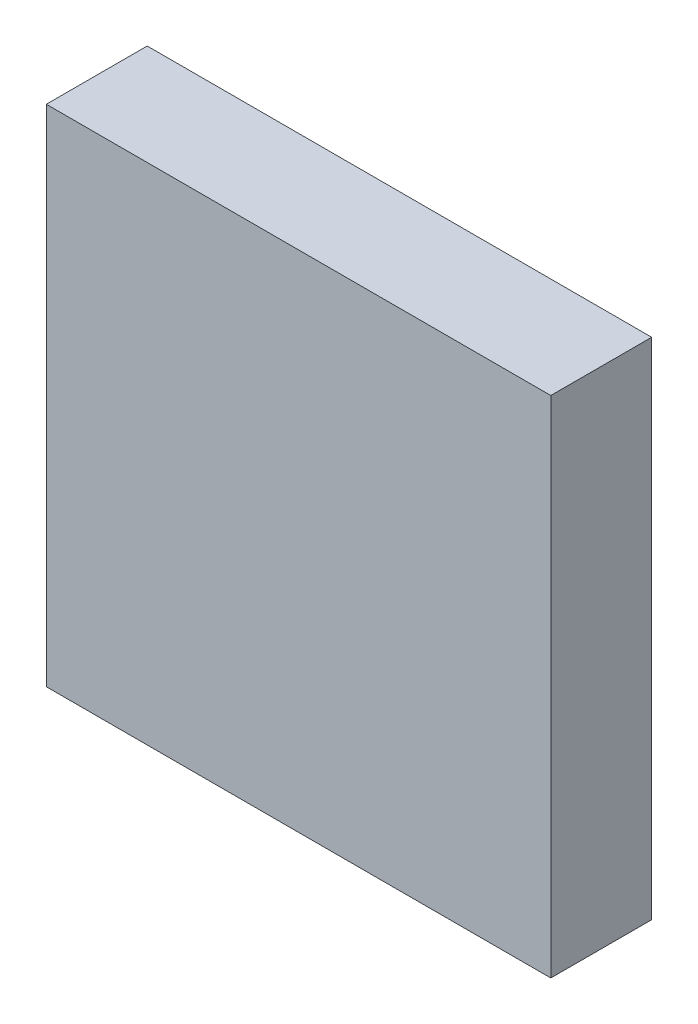
ISO-10303-21;
HEADER;
FILE_DESCRIPTION(('STEP AP214'),'2;1');
FILE_NAME('part.step','',(''),(''),'','','');
FILE_SCHEMA(('AUTOMOTIVE_DESIGN { 1 0 10303 214 1 1 1 1 }'));
ENDSEC;
DATA;
#1=APPLICATION_CONTEXT('core data for automotive mechanical design processes');
#2=APPLICATION_PROTOCOL_DEFINITION('international standard','automotive_design',2000,#1);
#3=PRODUCT_CONTEXT('',#1,'mechanical');
#4=PRODUCT('Part','Part','',(#3));
#5=PRODUCT_RELATED_PRODUCT_CATEGORY('part','',(#4));
#6=PRODUCT_DEFINITION_FORMATION('','',#4);
#7=PRODUCT_DEFINITION_CONTEXT('part definition',#1,'design');
#8=PRODUCT_DEFINITION('design','',#6,#7);
#9=PRODUCT_DEFINITION_SHAPE('','',#8);
#10=(LENGTH_UNIT() NAMED_UNIT(*) SI_UNIT(.MILLI.,.METRE.));
#11=(NAMED_UNIT(*) PLANE_ANGLE_UNIT() SI_UNIT($,.RADIAN.));
#12=(NAMED_UNIT(*) SI_UNIT($,.STERADIAN.) SOLID_ANGLE_UNIT());
#13=UNCERTAINTY_MEASURE_WITH_UNIT(LENGTH_MEASURE(1.E-05),#10,'distance_accuracy_value','');
#14=(GEOMETRIC_REPRESENTATION_CONTEXT(3) GLOBAL_UNCERTAINTY_ASSIGNED_CONTEXT((#13)) GLOBAL_UNIT_ASSIGNED_CONTEXT((#10,
#11,#12)) REPRESENTATION_CONTEXT('',''));
#15=CARTESIAN_POINT('',(0.,0.,0.));
#16=DIRECTION('',(0.,0.,1.));
#17=DIRECTION('',(1.,0.,0.));
#18=AXIS2_PLACEMENT_3D('',#15,#16,#17);
#19=CARTESIAN_POINT('',(-26.3757765244034,-0.619272768192042,-0.699998846695338));
#20=DIRECTION('',(0.,8.74227339409094E-08,-1.));
#21=DIRECTION('',(-4.37113882867396E-08,-1.,-8.74227339409093E-08));
#22=AXIS2_PLACEMENT_3D('',#19,#20,#21);
#23=PLANE('',#22);
#24=CARTESIAN_POINT('',(-26.3757765244034,-0.619272768192042,-0.699998846695338));
#25=DIRECTION('',(0.,8.74227339409094E-08,-1.));
#26=DIRECTION('',(-4.37113882867396E-08,-1.,-8.74227339409093E-08));
#27=AXIS2_PLACEMENT_3D('',#24,#25,#26);
#28=CIRCLE('',#27,0.25);
#29=CARTESIAN_POINT('',(-26.3757765353312,-0.869272768192042,-0.699998868551022));
#30=VERTEX_POINT('',#29);
#31=EDGE_CURVE('E11',#30,#30,#28,.T.);
#32=ORIENTED_EDGE('',*,*,#31,.T.);
#33=EDGE_LOOP('',(#32));
#34=FACE_BOUND('',#33,.T.);
#35=ADVANCED_FACE('F17',(#34),#23,.T.);
#36=CARTESIAN_POINT('',(-26.3757765244034,-0.619272768192042,-0.699998846695338));
#37=DIRECTION('',(0.,8.74227339409094E-08,-1.));
#38=DIRECTION('',(-4.37113882867396E-08,-1.,-8.74227339409093E-08));
#39=AXIS2_PLACEMENT_3D('',#36,#37,#38);
#40=CYLINDRICAL_SURFACE('',#39,0.25);
#41=CARTESIAN_POINT('',(-26.3757765244034,-0.619272759449771,-0.799998846695337));
#42=DIRECTION('',(0.,8.74227339409094E-08,-1.));
#43=DIRECTION('',(-4.37113882867396E-08,-1.,-8.74227339409093E-08));
#44=AXIS2_PLACEMENT_3D('',#41,#42,#43);
#45=CIRCLE('',#44,0.25);
#46=CARTESIAN_POINT('',(-26.3757765353312,-0.869272759449771,-0.799998868551021));
#47=VERTEX_POINT('',#46);
#48=EDGE_CURVE('E111',#47,#47,#45,.T.);
#49=ORIENTED_EDGE('',*,*,#48,.T.);
#50=EDGE_LOOP('',(#49));
#51=FACE_BOUND('',#50,.T.);
#52=ORIENTED_EDGE('',*,*,#31,.F.);
#53=EDGE_LOOP('',(#52));
#54=FACE_BOUND('',#53,.T.);
#55=ADVANCED_FACE('F169',(#51,#54),#40,.F.);
#56=CARTESIAN_POINT('',(-23.042443336775,-3.95260630842558,8.6189553410998E-07));
#57=DIRECTION('',(-4.37113882867396E-08,-1.,-8.74227339409093E-08));
#58=DIRECTION('',(0.,8.74227339409094E-08,-1.));
#59=AXIS2_PLACEMENT_3D('',#56,#57,#58);
#60=PLANE('',#59);
#61=DIRECTION('',(0.,8.74227339409094E-08,-1.));
#62=VECTOR('',#61,1.);
#63=CARTESIAN_POINT('',(-23.042443336775,-3.95260630842558,8.6189553410998E-07));
#64=LINE('',#63,#62);
#65=CARTESIAN_POINT('',(-23.042443336775,-3.95260630842558,8.6189553410998E-07));
#66=VERTEX_POINT('',#65);
#67=CARTESIAN_POINT('',(-23.042443336775,-3.95260623848738,-0.799999138104463));
#68=VERTEX_POINT('',#67);
#69=EDGE_CURVE('E76',#66,#68,#64,.T.);
#70=ORIENTED_EDGE('',*,*,#69,.F.);
#71=DIRECTION('',(-1.,4.37113882867395E-08,0.));
#72=VECTOR('',#71,1.);
#73=CARTESIAN_POINT('',(-23.042443336775,-3.95260630842558,8.6189553410998E-07));
#74=LINE('',#73,#72);
#75=CARTESIAN_POINT('',(-27.042443336775,-3.95260613358002,8.61895549722491E-07));
#76=VERTEX_POINT('',#75);
#77=EDGE_CURVE('E26',#66,#76,#74,.T.);
#78=ORIENTED_EDGE('',*,*,#77,.T.);
#79=DIRECTION('',(0.,8.74227339409094E-08,-1.));
#80=VECTOR('',#79,1.);
#81=CARTESIAN_POINT('',(-27.042443336775,-3.95260613358002,8.61895549722491E-07));
#82=LINE('',#81,#80);
#83=CARTESIAN_POINT('',(-27.042443336775,-3.95260606364184,-0.799999138104448));
#84=VERTEX_POINT('',#83);
#85=EDGE_CURVE('E71',#76,#84,#82,.T.);
#86=ORIENTED_EDGE('',*,*,#85,.T.);
#87=DIRECTION('',(-1.,4.37113882867395E-08,0.));
#88=VECTOR('',#87,1.);
#89=CARTESIAN_POINT('',(-23.042443336775,-3.95260623848738,-0.799999138104463));
#90=LINE('',#89,#88);
#91=EDGE_CURVE('E81',#68,#84,#90,.T.);
#92=ORIENTED_EDGE('',*,*,#91,.F.);
#93=EDGE_LOOP('',(#70,#78,#86,#92));
#94=FACE_BOUND('',#93,.T.);
#95=ADVANCED_FACE('F84',(#94),#60,.T.);
#96=CARTESIAN_POINT('',(-23.0424431619295,0.0473936915744155,1.21158647004016E-06));
#97=DIRECTION('',(0.,8.74227339409094E-08,-1.));
#98=DIRECTION('',(-4.37113882867396E-08,-1.,-8.74227339409093E-08));
#99=AXIS2_PLACEMENT_3D('',#96,#97,#98);
#100=PLANE('',#99);
#101=DIRECTION('',(-4.37113882867396E-08,-1.,-8.74227339409093E-08));
#102=VECTOR('',#101,1.);
#103=CARTESIAN_POINT('',(-27.0424431619295,0.0473938664199702,1.21158648521899E-06));
#104=LINE('',#103,#102);
#105=CARTESIAN_POINT('',(-27.0424431619295,0.0473938664199702,1.21158648521899E-06));
#106=VERTEX_POINT('',#105);
#107=EDGE_CURVE('E69',#106,#76,#104,.T.);
#108=ORIENTED_EDGE('',*,*,#107,.T.);
#109=ORIENTED_EDGE('',*,*,#77,.F.);
#110=DIRECTION('',(-4.37113882867396E-08,-1.,-8.74227339409093E-08));
#111=VECTOR('',#110,1.);
#112=CARTESIAN_POINT('',(-23.0424431619295,0.0473936915744155,1.21158647004016E-06));
#113=LINE('',#112,#111);
#114=CARTESIAN_POINT('',(-23.0424431619295,0.0473936915744155,1.21158647004016E-06));
#115=VERTEX_POINT('',#114);
#116=EDGE_CURVE('E64',#115,#66,#113,.T.);
#117=ORIENTED_EDGE('',*,*,#116,.F.);
#118=DIRECTION('',(-1.,4.37113882867395E-08,0.));
#119=VECTOR('',#118,1.);
#120=CARTESIAN_POINT('',(-23.0424431619295,0.0473936915744155,1.21158647004016E-06));
#121=LINE('',#120,#119);
#122=EDGE_CURVE('E93',#115,#106,#121,.T.);
#123=ORIENTED_EDGE('',*,*,#122,.T.);
#124=EDGE_LOOP('',(#108,#109,#117,#123));
#125=FACE_BOUND('',#124,.T.);
#126=ADVANCED_FACE('F68',(#125),#100,.F.);
#127=CARTESIAN_POINT('',(-27.0424431619295,0.0473938664199702,1.21158648521899E-06));
#128=DIRECTION('',(-1.,4.37113882867395E-08,0.));
#129=DIRECTION('',(0.,8.74227339409094E-08,-1.));
#130=AXIS2_PLACEMENT_3D('',#127,#128,#129);
#131=PLANE('',#130);
#132=ORIENTED_EDGE('',*,*,#107,.F.);
#133=DIRECTION('',(0.,8.74227339409094E-08,-1.));
#134=VECTOR('',#133,1.);
#135=CARTESIAN_POINT('',(-27.0424431619295,0.0473938664199702,1.21158648521899E-06));
#136=LINE('',#135,#134);
#137=CARTESIAN_POINT('',(-27.0424431619295,0.0473939363581644,-0.799998788413512));
#138=VERTEX_POINT('',#137);
#139=EDGE_CURVE('E135',#106,#138,#136,.T.);
#140=ORIENTED_EDGE('',*,*,#139,.T.);
#141=DIRECTION('',(-4.37113882867396E-08,-1.,-8.74227339409093E-08));
#142=VECTOR('',#141,1.);
#143=CARTESIAN_POINT('',(-27.0424431619295,0.0473939363581644,-0.799998788413512));
#144=LINE('',#143,#142);
#145=EDGE_CURVE('E109',#138,#84,#144,.T.);
#146=ORIENTED_EDGE('',*,*,#145,.T.);
#147=ORIENTED_EDGE('',*,*,#85,.F.);
#148=EDGE_LOOP('',(#132,#140,#146,#147));
#149=FACE_BOUND('',#148,.T.);
#150=ADVANCED_FACE('F158',(#149),#131,.T.);
#151=CARTESIAN_POINT('',(-23.0424431619295,0.0473937615126097,-0.799998788413527));
#152=DIRECTION('',(0.,8.74227339409094E-08,-1.));
#153=DIRECTION('',(-4.37113882867396E-08,-1.,-8.74227339409093E-08));
#154=AXIS2_PLACEMENT_3D('',#151,#152,#153);
#155=PLANE('',#154);
#156=ORIENTED_EDGE('',*,*,#48,.F.);
#157=EDGE_LOOP('',(#156));
#158=FACE_BOUND('',#157,.T.);
#159=DIRECTION('',(-1.,4.37113882867395E-08,0.));
#160=VECTOR('',#159,1.);
#161=CARTESIAN_POINT('',(-23.0424431619295,0.0473937615126097,-0.799998788413527));
#162=LINE('',#161,#160);
#163=CARTESIAN_POINT('',(-23.0424431619295,0.0473937615126097,-0.799998788413527));
#164=VERTEX_POINT('',#163);
#165=EDGE_CURVE('E139',#164,#138,#162,.T.);
#166=ORIENTED_EDGE('',*,*,#165,.F.);
#167=DIRECTION('',(-4.37113882867396E-08,-1.,-8.74227339409093E-08));
#168=VECTOR('',#167,1.);
#169=CARTESIAN_POINT('',(-23.0424431619295,0.0473937615126097,-0.799998788413527));
#170=LINE('',#169,#168);
#171=EDGE_CURVE('E82',#164,#68,#170,.T.);
#172=ORIENTED_EDGE('',*,*,#171,.T.);
#173=ORIENTED_EDGE('',*,*,#91,.T.);
#174=ORIENTED_EDGE('',*,*,#145,.F.);
#175=EDGE_LOOP('',(#166,#172,#173,#174));
#176=FACE_BOUND('',#175,.T.);
#177=ADVANCED_FACE('F156',(#158,#176),#155,.T.);
#178=CARTESIAN_POINT('',(-23.0424431619295,0.0473936915744155,1.21158647004016E-06));
#179=DIRECTION('',(-1.,4.37113882867395E-08,0.));
#180=DIRECTION('',(0.,8.74227339409094E-08,-1.));
#181=AXIS2_PLACEMENT_3D('',#178,#179,#180);
#182=PLANE('',#181);
#183=ORIENTED_EDGE('',*,*,#69,.T.);
#184=ORIENTED_EDGE('',*,*,#171,.F.);
#185=DIRECTION('',(0.,8.74227339409094E-08,-1.));
#186=VECTOR('',#185,1.);
#187=CARTESIAN_POINT('',(-23.0424431619295,0.0473936915744155,1.21158647004016E-06));
#188=LINE('',#187,#186);
#189=EDGE_CURVE('E78',#115,#164,#188,.T.);
#190=ORIENTED_EDGE('',*,*,#189,.F.);
#191=ORIENTED_EDGE('',*,*,#116,.T.);
#192=EDGE_LOOP('',(#183,#184,#190,#191));
#193=FACE_BOUND('',#192,.T.);
#194=ADVANCED_FACE('F75',(#193),#182,.F.);
#195=CARTESIAN_POINT('',(-23.0424431619295,0.0473936915744155,1.21158647004016E-06));
#196=DIRECTION('',(-4.37113882867396E-08,-1.,-8.74227339409093E-08));
#197=DIRECTION('',(0.,8.74227339409094E-08,-1.));
#198=AXIS2_PLACEMENT_3D('',#195,#196,#197);
#199=PLANE('',#198);
#200=ORIENTED_EDGE('',*,*,#165,.T.);
#201=ORIENTED_EDGE('',*,*,#139,.F.);
#202=ORIENTED_EDGE('',*,*,#122,.F.);
#203=ORIENTED_EDGE('',*,*,#189,.T.);
#204=EDGE_LOOP('',(#200,#201,#202,#203));
#205=FACE_BOUND('',#204,.T.);
#206=ADVANCED_FACE('F154',(#205),#199,.F.);
#207=CLOSED_SHELL('',(#35,#55,#95,#126,#150,#177,#194,#206));
#208=MANIFOLD_SOLID_BREP('B1',#207);
#209=ADVANCED_BREP_SHAPE_REPRESENTATION('',(#18,#208),#14);
#210=SHAPE_DEFINITION_REPRESENTATION(#9,#209);
ENDSEC;
END-ISO-10303-21;
